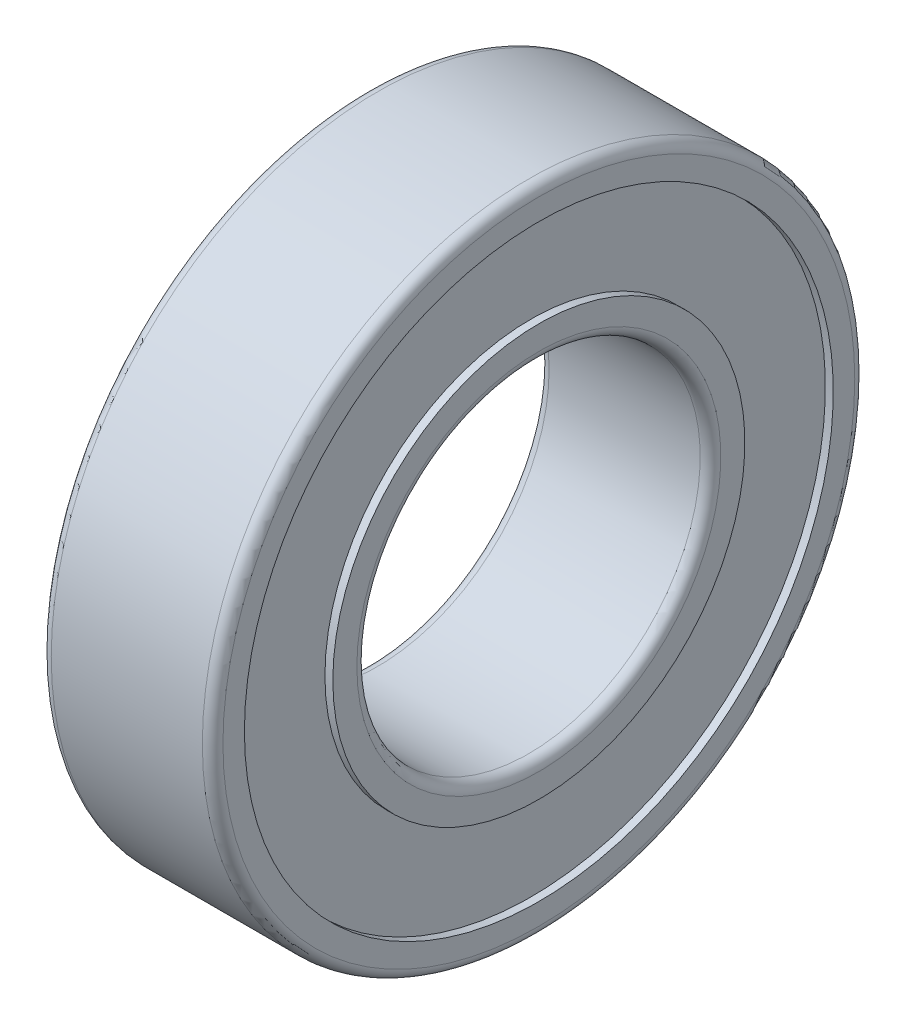
ISO-10303-21;
HEADER;
FILE_DESCRIPTION(('STEP AP214'),'2;1');
FILE_NAME('part.step','',(''),(''),'','','');
FILE_SCHEMA(('AUTOMOTIVE_DESIGN { 1 0 10303 214 1 1 1 1 }'));
ENDSEC;
DATA;
#1=APPLICATION_CONTEXT('core data for automotive mechanical design processes');
#2=APPLICATION_PROTOCOL_DEFINITION('international standard','automotive_design',2000,#1);
#3=PRODUCT_CONTEXT('',#1,'mechanical');
#4=PRODUCT('Part','Part','',(#3));
#5=PRODUCT_RELATED_PRODUCT_CATEGORY('part','',(#4));
#6=PRODUCT_DEFINITION_FORMATION('','',#4);
#7=PRODUCT_DEFINITION_CONTEXT('part definition',#1,'design');
#8=PRODUCT_DEFINITION('design','',#6,#7);
#9=PRODUCT_DEFINITION_SHAPE('','',#8);
#10=(LENGTH_UNIT() NAMED_UNIT(*) SI_UNIT(.MILLI.,.METRE.));
#11=(NAMED_UNIT(*) PLANE_ANGLE_UNIT() SI_UNIT($,.RADIAN.));
#12=(NAMED_UNIT(*) SI_UNIT($,.STERADIAN.) SOLID_ANGLE_UNIT());
#13=UNCERTAINTY_MEASURE_WITH_UNIT(LENGTH_MEASURE(1.E-05),#10,'distance_accuracy_value','');
#14=(GEOMETRIC_REPRESENTATION_CONTEXT(3) GLOBAL_UNCERTAINTY_ASSIGNED_CONTEXT((#13)) GLOBAL_UNIT_ASSIGNED_CONTEXT((#10,
#11,#12)) REPRESENTATION_CONTEXT('',''));
#15=CARTESIAN_POINT('',(0.,0.,0.));
#16=DIRECTION('',(0.,0.,1.));
#17=DIRECTION('',(1.,0.,0.));
#18=AXIS2_PLACEMENT_3D('',#15,#16,#17);
#19=CARTESIAN_POINT('',(0.,9.5,0.));
#20=DIRECTION('',(1.,0.,0.));
#21=DIRECTION('',(0.,0.,-1.));
#22=AXIS2_PLACEMENT_3D('',#19,#20,#21);
#23=PLANE('',#22);
#24=CARTESIAN_POINT('',(0.,0.,0.));
#25=DIRECTION('',(1.,0.,0.));
#26=DIRECTION('',(0.,0.,-1.));
#27=AXIS2_PLACEMENT_3D('',#24,#25,#26);
#28=CIRCLE('',#27,9.2);
#29=CARTESIAN_POINT('',(0.,0.,-9.2));
#30=VERTEX_POINT('',#29);
#31=EDGE_CURVE('E54',#30,#30,#28,.F.);
#32=ORIENTED_EDGE('',*,*,#31,.T.);
#33=EDGE_LOOP('',(#32));
#34=FACE_BOUND('',#33,.T.);
#35=CARTESIAN_POINT('',(0.,0.,0.));
#36=DIRECTION('',(-1.,0.,0.));
#37=DIRECTION('',(0.,0.,1.));
#38=AXIS2_PLACEMENT_3D('',#35,#36,#37);
#39=CIRCLE('',#38,8.575);
#40=CARTESIAN_POINT('',(0.,0.,8.575));
#41=VERTEX_POINT('',#40);
#42=EDGE_CURVE('E66',#41,#41,#39,.T.);
#43=ORIENTED_EDGE('',*,*,#42,.F.);
#44=EDGE_LOOP('',(#43));
#45=FACE_BOUND('',#44,.T.);
#46=ADVANCED_FACE('F34',(#34,#45),#23,.F.);
#47=CARTESIAN_POINT('',(0.,0.,0.));
#48=DIRECTION('',(-1.,0.,0.));
#49=DIRECTION('',(0.,0.,1.));
#50=AXIS2_PLACEMENT_3D('',#47,#48,#49);
#51=CYLINDRICAL_SURFACE('',#50,8.575);
#52=CARTESIAN_POINT('',(0.23,0.,0.));
#53=DIRECTION('',(-1.,0.,0.));
#54=DIRECTION('',(0.,0.,1.));
#55=AXIS2_PLACEMENT_3D('',#52,#53,#54);
#56=CIRCLE('',#55,8.575);
#57=CARTESIAN_POINT('',(0.23,0.,8.575));
#58=VERTEX_POINT('',#57);
#59=EDGE_CURVE('E69',#58,#58,#56,.T.);
#60=ORIENTED_EDGE('',*,*,#59,.F.);
#61=EDGE_LOOP('',(#60));
#62=FACE_BOUND('',#61,.T.);
#63=ORIENTED_EDGE('',*,*,#42,.T.);
#64=EDGE_LOOP('',(#63));
#65=FACE_BOUND('',#64,.T.);
#66=ADVANCED_FACE('F122',(#62,#65),#51,.F.);
#67=CARTESIAN_POINT('',(0.23,8.575,0.));
#68=DIRECTION('',(1.,0.,0.));
#69=DIRECTION('',(0.,0.,-1.));
#70=AXIS2_PLACEMENT_3D('',#67,#68,#69);
#71=PLANE('',#70);
#72=CARTESIAN_POINT('',(0.23,0.,0.));
#73=DIRECTION('',(-1.,0.,0.));
#74=DIRECTION('',(0.,0.,1.));
#75=AXIS2_PLACEMENT_3D('',#72,#73,#74);
#76=CIRCLE('',#75,6.);
#77=CARTESIAN_POINT('',(0.23,0.,6.));
#78=VERTEX_POINT('',#77);
#79=EDGE_CURVE('E72',#78,#78,#76,.T.);
#80=ORIENTED_EDGE('',*,*,#79,.F.);
#81=EDGE_LOOP('',(#80));
#82=FACE_BOUND('',#81,.T.);
#83=ORIENTED_EDGE('',*,*,#59,.T.);
#84=EDGE_LOOP('',(#83));
#85=FACE_BOUND('',#84,.T.);
#86=ADVANCED_FACE('F128',(#82,#85),#71,.F.);
#87=CARTESIAN_POINT('',(0.,0.,0.));
#88=DIRECTION('',(-1.,0.,0.));
#89=DIRECTION('',(0.,0.,1.));
#90=AXIS2_PLACEMENT_3D('',#87,#88,#89);
#91=CYLINDRICAL_SURFACE('',#90,6.);
#92=CARTESIAN_POINT('',(0.,0.,0.));
#93=DIRECTION('',(-1.,0.,0.));
#94=DIRECTION('',(0.,0.,1.));
#95=AXIS2_PLACEMENT_3D('',#92,#93,#94);
#96=CIRCLE('',#95,6.);
#97=CARTESIAN_POINT('',(0.,0.,6.));
#98=VERTEX_POINT('',#97);
#99=EDGE_CURVE('E75',#98,#98,#96,.T.);
#100=ORIENTED_EDGE('',*,*,#99,.F.);
#101=EDGE_LOOP('',(#100));
#102=FACE_BOUND('',#101,.T.);
#103=ORIENTED_EDGE('',*,*,#79,.T.);
#104=EDGE_LOOP('',(#103));
#105=FACE_BOUND('',#104,.T.);
#106=ADVANCED_FACE('F181',(#102,#105),#91,.T.);
#107=CARTESIAN_POINT('',(0.,6.,0.));
#108=DIRECTION('',(1.,0.,0.));
#109=DIRECTION('',(0.,0.,-1.));
#110=AXIS2_PLACEMENT_3D('',#107,#108,#109);
#111=PLANE('',#110);
#112=CARTESIAN_POINT('',(0.,0.,0.));
#113=DIRECTION('',(1.,0.,0.));
#114=DIRECTION('',(0.,0.,-1.));
#115=AXIS2_PLACEMENT_3D('',#112,#113,#114);
#116=CIRCLE('',#115,5.3);
#117=CARTESIAN_POINT('',(0.,0.,-5.3));
#118=VERTEX_POINT('',#117);
#119=EDGE_CURVE('E10',#118,#118,#116,.T.);
#120=ORIENTED_EDGE('',*,*,#119,.T.);
#121=EDGE_LOOP('',(#120));
#122=FACE_BOUND('',#121,.T.);
#123=ORIENTED_EDGE('',*,*,#99,.T.);
#124=EDGE_LOOP('',(#123));
#125=FACE_BOUND('',#124,.T.);
#126=ADVANCED_FACE('F119',(#122,#125),#111,.F.);
#127=CARTESIAN_POINT('',(0.,0.,0.));
#128=DIRECTION('',(-1.,0.,0.));
#129=DIRECTION('',(0.,0.,1.));
#130=AXIS2_PLACEMENT_3D('',#127,#128,#129);
#131=CYLINDRICAL_SURFACE('',#130,5.);
#132=CARTESIAN_POINT('',(4.7,0.,0.));
#133=DIRECTION('',(-1.,0.,0.));
#134=DIRECTION('',(0.,0.,1.));
#135=AXIS2_PLACEMENT_3D('',#132,#133,#134);
#136=CIRCLE('',#135,5.);
#137=CARTESIAN_POINT('',(4.7,0.,5.));
#138=VERTEX_POINT('',#137);
#139=EDGE_CURVE('E41',#138,#138,#136,.F.);
#140=ORIENTED_EDGE('',*,*,#139,.T.);
#141=EDGE_LOOP('',(#140));
#142=FACE_BOUND('',#141,.T.);
#143=CARTESIAN_POINT('',(0.300000000000003,0.,0.));
#144=DIRECTION('',(1.,0.,0.));
#145=DIRECTION('',(0.,0.,-1.));
#146=AXIS2_PLACEMENT_3D('',#143,#144,#145);
#147=CIRCLE('',#146,5.);
#148=CARTESIAN_POINT('',(0.300000000000003,0.,-5.));
#149=VERTEX_POINT('',#148);
#150=EDGE_CURVE('E45',#149,#149,#147,.F.);
#151=ORIENTED_EDGE('',*,*,#150,.T.);
#152=EDGE_LOOP('',(#151));
#153=FACE_BOUND('',#152,.T.);
#154=ADVANCED_FACE('F113',(#142,#153),#131,.F.);
#155=CARTESIAN_POINT('',(5.,6.,0.));
#156=DIRECTION('',(-1.,0.,0.));
#157=DIRECTION('',(0.,0.,1.));
#158=AXIS2_PLACEMENT_3D('',#155,#156,#157);
#159=PLANE('',#158);
#160=CARTESIAN_POINT('',(5.,0.,0.));
#161=DIRECTION('',(-1.,0.,0.));
#162=DIRECTION('',(0.,0.,1.));
#163=AXIS2_PLACEMENT_3D('',#160,#161,#162);
#164=CIRCLE('',#163,5.3);
#165=CARTESIAN_POINT('',(5.,0.,5.3));
#166=VERTEX_POINT('',#165);
#167=EDGE_CURVE('E49',#166,#166,#164,.T.);
#168=ORIENTED_EDGE('',*,*,#167,.T.);
#169=EDGE_LOOP('',(#168));
#170=FACE_BOUND('',#169,.T.);
#171=CARTESIAN_POINT('',(5.,0.,0.));
#172=DIRECTION('',(-1.,0.,0.));
#173=DIRECTION('',(0.,0.,1.));
#174=AXIS2_PLACEMENT_3D('',#171,#172,#173);
#175=CIRCLE('',#174,6.);
#176=CARTESIAN_POINT('',(5.,0.,6.));
#177=VERTEX_POINT('',#176);
#178=EDGE_CURVE('E78',#177,#177,#175,.T.);
#179=ORIENTED_EDGE('',*,*,#178,.F.);
#180=EDGE_LOOP('',(#179));
#181=FACE_BOUND('',#180,.T.);
#182=ADVANCED_FACE('F108',(#170,#181),#159,.F.);
#183=CARTESIAN_POINT('',(0.,0.,0.));
#184=DIRECTION('',(-1.,0.,0.));
#185=DIRECTION('',(0.,0.,1.));
#186=AXIS2_PLACEMENT_3D('',#183,#184,#185);
#187=CYLINDRICAL_SURFACE('',#186,6.);
#188=CARTESIAN_POINT('',(4.77,0.,0.));
#189=DIRECTION('',(-1.,0.,0.));
#190=DIRECTION('',(0.,0.,1.));
#191=AXIS2_PLACEMENT_3D('',#188,#189,#190);
#192=CIRCLE('',#191,6.);
#193=CARTESIAN_POINT('',(4.77,0.,6.));
#194=VERTEX_POINT('',#193);
#195=EDGE_CURVE('E81',#194,#194,#192,.T.);
#196=ORIENTED_EDGE('',*,*,#195,.F.);
#197=EDGE_LOOP('',(#196));
#198=FACE_BOUND('',#197,.T.);
#199=ORIENTED_EDGE('',*,*,#178,.T.);
#200=EDGE_LOOP('',(#199));
#201=FACE_BOUND('',#200,.T.);
#202=ADVANCED_FACE('F102',(#198,#201),#187,.T.);
#203=CARTESIAN_POINT('',(4.77,8.575,0.));
#204=DIRECTION('',(-1.,0.,0.));
#205=DIRECTION('',(0.,0.,1.));
#206=AXIS2_PLACEMENT_3D('',#203,#204,#205);
#207=PLANE('',#206);
#208=CARTESIAN_POINT('',(4.77,0.,0.));
#209=DIRECTION('',(-1.,0.,0.));
#210=DIRECTION('',(0.,0.,1.));
#211=AXIS2_PLACEMENT_3D('',#208,#209,#210);
#212=CIRCLE('',#211,8.575);
#213=CARTESIAN_POINT('',(4.77,0.,8.575));
#214=VERTEX_POINT('',#213);
#215=EDGE_CURVE('E84',#214,#214,#212,.T.);
#216=ORIENTED_EDGE('',*,*,#215,.F.);
#217=EDGE_LOOP('',(#216));
#218=FACE_BOUND('',#217,.T.);
#219=ORIENTED_EDGE('',*,*,#195,.T.);
#220=EDGE_LOOP('',(#219));
#221=FACE_BOUND('',#220,.T.);
#222=ADVANCED_FACE('F96',(#218,#221),#207,.F.);
#223=CARTESIAN_POINT('',(0.,0.,0.));
#224=DIRECTION('',(-1.,0.,0.));
#225=DIRECTION('',(0.,0.,1.));
#226=AXIS2_PLACEMENT_3D('',#223,#224,#225);
#227=CYLINDRICAL_SURFACE('',#226,8.575);
#228=CARTESIAN_POINT('',(5.,0.,0.));
#229=DIRECTION('',(-1.,0.,0.));
#230=DIRECTION('',(0.,0.,1.));
#231=AXIS2_PLACEMENT_3D('',#228,#229,#230);
#232=CIRCLE('',#231,8.575);
#233=CARTESIAN_POINT('',(5.,0.,8.575));
#234=VERTEX_POINT('',#233);
#235=EDGE_CURVE('E87',#234,#234,#232,.T.);
#236=ORIENTED_EDGE('',*,*,#235,.F.);
#237=EDGE_LOOP('',(#236));
#238=FACE_BOUND('',#237,.T.);
#239=ORIENTED_EDGE('',*,*,#215,.T.);
#240=EDGE_LOOP('',(#239));
#241=FACE_BOUND('',#240,.T.);
#242=ADVANCED_FACE('F93',(#238,#241),#227,.F.);
#243=CARTESIAN_POINT('',(5.,9.5,0.));
#244=DIRECTION('',(-1.,0.,0.));
#245=DIRECTION('',(0.,0.,1.));
#246=AXIS2_PLACEMENT_3D('',#243,#244,#245);
#247=PLANE('',#246);
#248=CARTESIAN_POINT('',(5.,0.,0.));
#249=DIRECTION('',(-1.,0.,0.));
#250=DIRECTION('',(0.,0.,1.));
#251=AXIS2_PLACEMENT_3D('',#248,#249,#250);
#252=CIRCLE('',#251,9.2);
#253=CARTESIAN_POINT('',(5.,0.,9.2));
#254=VERTEX_POINT('',#253);
#255=EDGE_CURVE('E57',#254,#254,#252,.F.);
#256=ORIENTED_EDGE('',*,*,#255,.T.);
#257=EDGE_LOOP('',(#256));
#258=FACE_BOUND('',#257,.T.);
#259=ORIENTED_EDGE('',*,*,#235,.T.);
#260=EDGE_LOOP('',(#259));
#261=FACE_BOUND('',#260,.T.);
#262=ADVANCED_FACE('F91',(#258,#261),#247,.F.);
#263=CARTESIAN_POINT('',(0.,0.,0.));
#264=DIRECTION('',(-1.,0.,0.));
#265=DIRECTION('',(0.,0.,1.));
#266=AXIS2_PLACEMENT_3D('',#263,#264,#265);
#267=CYLINDRICAL_SURFACE('',#266,9.5);
#268=CARTESIAN_POINT('',(4.7,0.,0.));
#269=DIRECTION('',(-1.,0.,0.));
#270=DIRECTION('',(0.,0.,1.));
#271=AXIS2_PLACEMENT_3D('',#268,#269,#270);
#272=CIRCLE('',#271,9.5);
#273=CARTESIAN_POINT('',(4.7,0.,9.5));
#274=VERTEX_POINT('',#273);
#275=EDGE_CURVE('E60',#274,#274,#272,.T.);
#276=ORIENTED_EDGE('',*,*,#275,.T.);
#277=EDGE_LOOP('',(#276));
#278=FACE_BOUND('',#277,.T.);
#279=CARTESIAN_POINT('',(0.3,0.,0.));
#280=DIRECTION('',(1.,0.,0.));
#281=DIRECTION('',(0.,0.,-1.));
#282=AXIS2_PLACEMENT_3D('',#279,#280,#281);
#283=CIRCLE('',#282,9.5);
#284=CARTESIAN_POINT('',(0.3,0.,-9.5));
#285=VERTEX_POINT('',#284);
#286=EDGE_CURVE('E63',#285,#285,#283,.T.);
#287=ORIENTED_EDGE('',*,*,#286,.T.);
#288=EDGE_LOOP('',(#287));
#289=FACE_BOUND('',#288,.T.);
#290=ADVANCED_FACE('F138',(#278,#289),#267,.T.);
#291=CARTESIAN_POINT('',(4.7,0.,0.));
#292=DIRECTION('',(-1.,0.,0.));
#293=DIRECTION('',(0.,0.,1.));
#294=AXIS2_PLACEMENT_3D('',#291,#292,#293);
#295=TOROIDAL_SURFACE('',#294,9.2,0.3);
#296=ORIENTED_EDGE('',*,*,#255,.F.);
#297=EDGE_LOOP('',(#296));
#298=FACE_BOUND('',#297,.T.);
#299=ORIENTED_EDGE('',*,*,#275,.F.);
#300=EDGE_LOOP('',(#299));
#301=FACE_BOUND('',#300,.T.);
#302=ADVANCED_FACE('F134',(#298,#301),#295,.T.);
#303=CARTESIAN_POINT('',(0.3,0.,0.));
#304=DIRECTION('',(1.,0.,0.));
#305=DIRECTION('',(0.,0.,-1.));
#306=AXIS2_PLACEMENT_3D('',#303,#304,#305);
#307=TOROIDAL_SURFACE('',#306,9.2,0.3);
#308=ORIENTED_EDGE('',*,*,#286,.F.);
#309=EDGE_LOOP('',(#308));
#310=FACE_BOUND('',#309,.T.);
#311=ORIENTED_EDGE('',*,*,#31,.F.);
#312=EDGE_LOOP('',(#311));
#313=FACE_BOUND('',#312,.T.);
#314=ADVANCED_FACE('F137',(#310,#313),#307,.T.);
#315=CARTESIAN_POINT('',(4.7,0.,0.));
#316=DIRECTION('',(-1.,0.,0.));
#317=DIRECTION('',(0.,0.,1.));
#318=AXIS2_PLACEMENT_3D('',#315,#316,#317);
#319=TOROIDAL_SURFACE('',#318,5.3,0.3);
#320=ORIENTED_EDGE('',*,*,#139,.F.);
#321=EDGE_LOOP('',(#320));
#322=FACE_BOUND('',#321,.T.);
#323=ORIENTED_EDGE('',*,*,#167,.F.);
#324=EDGE_LOOP('',(#323));
#325=FACE_BOUND('',#324,.T.);
#326=ADVANCED_FACE('F141',(#322,#325),#319,.T.);
#327=CARTESIAN_POINT('',(0.300000000000003,0.,0.));
#328=DIRECTION('',(1.,0.,0.));
#329=DIRECTION('',(0.,0.,-1.));
#330=AXIS2_PLACEMENT_3D('',#327,#328,#329);
#331=TOROIDAL_SURFACE('',#330,5.3,0.3);
#332=ORIENTED_EDGE('',*,*,#119,.F.);
#333=EDGE_LOOP('',(#332));
#334=FACE_BOUND('',#333,.T.);
#335=ORIENTED_EDGE('',*,*,#150,.F.);
#336=EDGE_LOOP('',(#335));
#337=FACE_BOUND('',#336,.T.);
#338=ADVANCED_FACE('F36',(#334,#337),#331,.T.);
#339=CLOSED_SHELL('',(#46,#66,#86,#106,#126,#154,#182,#202,#222,#242,#262,#290,#302,#314,#326,#338));
#340=MANIFOLD_SOLID_BREP('B2',#339);
#341=ADVANCED_BREP_SHAPE_REPRESENTATION('',(#18,#340),#14);
#342=SHAPE_DEFINITION_REPRESENTATION(#9,#341);
ENDSEC;
END-ISO-10303-21;
